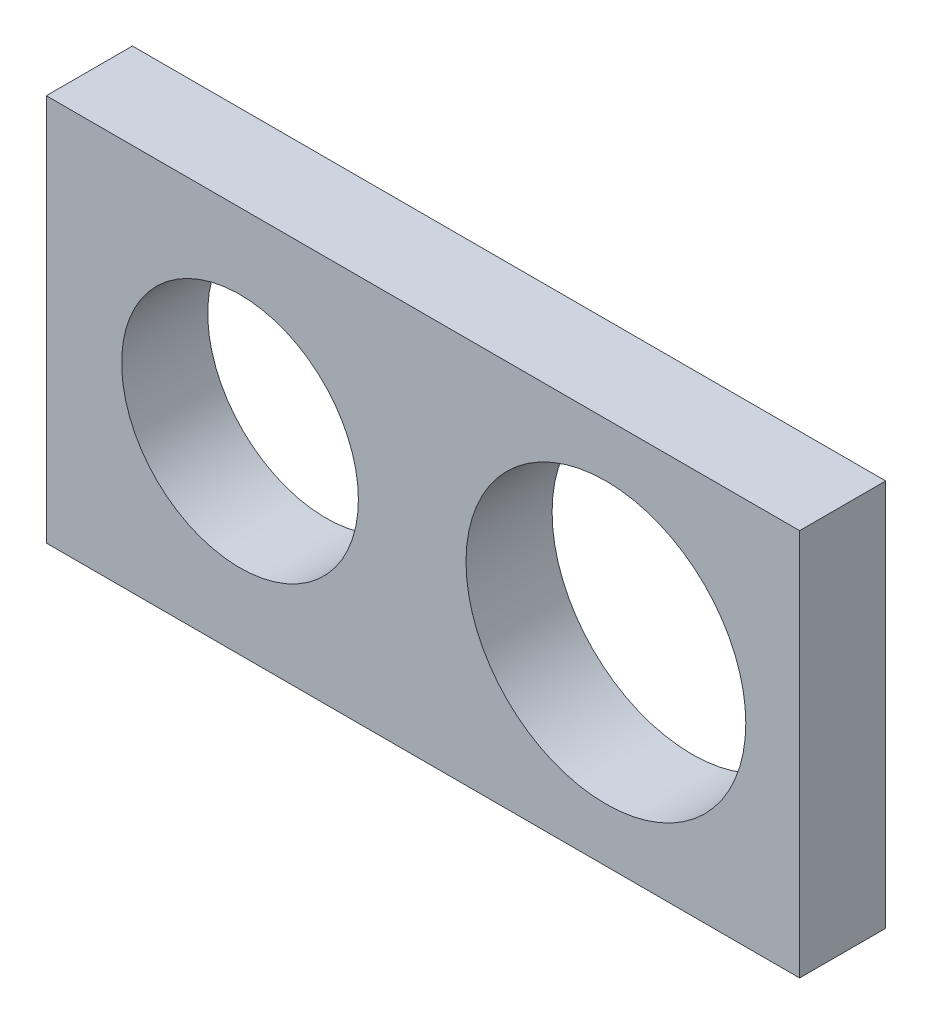
ISO-10303-21;
HEADER;
FILE_DESCRIPTION(('STEP AP214'),'2;1');
FILE_NAME('part.step','',(''),(''),'','','');
FILE_SCHEMA(('AUTOMOTIVE_DESIGN { 1 0 10303 214 1 1 1 1 }'));
ENDSEC;
DATA;
#1=APPLICATION_CONTEXT('core data for automotive mechanical design processes');
#2=APPLICATION_PROTOCOL_DEFINITION('international standard','automotive_design',2000,#1);
#3=PRODUCT_CONTEXT('',#1,'mechanical');
#4=PRODUCT('Part','Part','',(#3));
#5=PRODUCT_RELATED_PRODUCT_CATEGORY('part','',(#4));
#6=PRODUCT_DEFINITION_FORMATION('','',#4);
#7=PRODUCT_DEFINITION_CONTEXT('part definition',#1,'design');
#8=PRODUCT_DEFINITION('design','',#6,#7);
#9=PRODUCT_DEFINITION_SHAPE('','',#8);
#10=(LENGTH_UNIT() NAMED_UNIT(*) SI_UNIT(.MILLI.,.METRE.));
#11=(NAMED_UNIT(*) PLANE_ANGLE_UNIT() SI_UNIT($,.RADIAN.));
#12=(NAMED_UNIT(*) SI_UNIT($,.STERADIAN.) SOLID_ANGLE_UNIT());
#13=UNCERTAINTY_MEASURE_WITH_UNIT(LENGTH_MEASURE(1.E-05),#10,'distance_accuracy_value','');
#14=(GEOMETRIC_REPRESENTATION_CONTEXT(3) GLOBAL_UNCERTAINTY_ASSIGNED_CONTEXT((#13)) GLOBAL_UNIT_ASSIGNED_CONTEXT((#10,
#11,#12)) REPRESENTATION_CONTEXT('',''));
#15=CARTESIAN_POINT('',(0.,0.,0.));
#16=DIRECTION('',(0.,0.,1.));
#17=DIRECTION('',(1.,0.,0.));
#18=AXIS2_PLACEMENT_3D('',#15,#16,#17);
#19=CARTESIAN_POINT('',(-35.,18.,8.));
#20=DIRECTION('',(1.,0.,0.));
#21=DIRECTION('',(0.,0.,-1.));
#22=AXIS2_PLACEMENT_3D('',#19,#20,#21);
#23=PLANE('',#22);
#24=DIRECTION('',(0.,-1.,0.));
#25=VECTOR('',#24,1.);
#26=CARTESIAN_POINT('',(-35.,18.,0.));
#27=LINE('',#26,#25);
#28=CARTESIAN_POINT('',(-35.,18.,0.));
#29=VERTEX_POINT('',#28);
#30=CARTESIAN_POINT('',(-35.,-18.,0.));
#31=VERTEX_POINT('',#30);
#32=EDGE_CURVE('E103',#29,#31,#27,.T.);
#33=ORIENTED_EDGE('',*,*,#32,.T.);
#34=DIRECTION('',(0.,0.,-1.));
#35=VECTOR('',#34,1.);
#36=CARTESIAN_POINT('',(-35.,-18.,8.));
#37=LINE('',#36,#35);
#38=CARTESIAN_POINT('',(-35.,-18.,8.));
#39=VERTEX_POINT('',#38);
#40=EDGE_CURVE('E11',#39,#31,#37,.T.);
#41=ORIENTED_EDGE('',*,*,#40,.F.);
#42=DIRECTION('',(0.,-1.,0.));
#43=VECTOR('',#42,1.);
#44=CARTESIAN_POINT('',(-35.,18.,8.));
#45=LINE('',#44,#43);
#46=CARTESIAN_POINT('',(-35.,18.,8.));
#47=VERTEX_POINT('',#46);
#48=EDGE_CURVE('E90',#47,#39,#45,.T.);
#49=ORIENTED_EDGE('',*,*,#48,.F.);
#50=DIRECTION('',(0.,0.,-1.));
#51=VECTOR('',#50,1.);
#52=CARTESIAN_POINT('',(-35.,18.,8.));
#53=LINE('',#52,#51);
#54=EDGE_CURVE('E99',#47,#29,#53,.T.);
#55=ORIENTED_EDGE('',*,*,#54,.T.);
#56=EDGE_LOOP('',(#33,#41,#49,#55));
#57=FACE_BOUND('',#56,.T.);
#58=ADVANCED_FACE('F37',(#57),#23,.F.);
#59=CARTESIAN_POINT('',(-35.,-18.,8.));
#60=DIRECTION('',(0.,1.,0.));
#61=DIRECTION('',(0.,0.,1.));
#62=AXIS2_PLACEMENT_3D('',#59,#60,#61);
#63=PLANE('',#62);
#64=DIRECTION('',(1.,0.,0.));
#65=VECTOR('',#64,1.);
#66=CARTESIAN_POINT('',(-35.,-18.,0.));
#67=LINE('',#66,#65);
#68=CARTESIAN_POINT('',(35.,-18.,0.));
#69=VERTEX_POINT('',#68);
#70=EDGE_CURVE('E94',#31,#69,#67,.T.);
#71=ORIENTED_EDGE('',*,*,#70,.T.);
#72=DIRECTION('',(0.,0.,-1.));
#73=VECTOR('',#72,1.);
#74=CARTESIAN_POINT('',(35.,-18.,8.));
#75=LINE('',#74,#73);
#76=CARTESIAN_POINT('',(35.,-18.,8.));
#77=VERTEX_POINT('',#76);
#78=EDGE_CURVE('E46',#77,#69,#75,.T.);
#79=ORIENTED_EDGE('',*,*,#78,.F.);
#80=DIRECTION('',(1.,0.,0.));
#81=VECTOR('',#80,1.);
#82=CARTESIAN_POINT('',(-35.,-18.,8.));
#83=LINE('',#82,#81);
#84=EDGE_CURVE('E85',#39,#77,#83,.T.);
#85=ORIENTED_EDGE('',*,*,#84,.F.);
#86=ORIENTED_EDGE('',*,*,#40,.T.);
#87=EDGE_LOOP('',(#71,#79,#85,#86));
#88=FACE_BOUND('',#87,.T.);
#89=ADVANCED_FACE('F93',(#88),#63,.F.);
#90=CARTESIAN_POINT('',(35.,-18.,8.));
#91=DIRECTION('',(-1.,0.,0.));
#92=DIRECTION('',(0.,0.,1.));
#93=AXIS2_PLACEMENT_3D('',#90,#91,#92);
#94=PLANE('',#93);
#95=DIRECTION('',(0.,1.,0.));
#96=VECTOR('',#95,1.);
#97=CARTESIAN_POINT('',(35.,-18.,0.));
#98=LINE('',#97,#96);
#99=CARTESIAN_POINT('',(35.,18.,0.));
#100=VERTEX_POINT('',#99);
#101=EDGE_CURVE('E72',#69,#100,#98,.T.);
#102=ORIENTED_EDGE('',*,*,#101,.T.);
#103=DIRECTION('',(0.,0.,-1.));
#104=VECTOR('',#103,1.);
#105=CARTESIAN_POINT('',(35.,18.,8.));
#106=LINE('',#105,#104);
#107=CARTESIAN_POINT('',(35.,18.,8.));
#108=VERTEX_POINT('',#107);
#109=EDGE_CURVE('E95',#108,#100,#106,.T.);
#110=ORIENTED_EDGE('',*,*,#109,.F.);
#111=DIRECTION('',(0.,1.,0.));
#112=VECTOR('',#111,1.);
#113=CARTESIAN_POINT('',(35.,-18.,8.));
#114=LINE('',#113,#112);
#115=EDGE_CURVE('E88',#77,#108,#114,.T.);
#116=ORIENTED_EDGE('',*,*,#115,.F.);
#117=ORIENTED_EDGE('',*,*,#78,.T.);
#118=EDGE_LOOP('',(#102,#110,#116,#117));
#119=FACE_BOUND('',#118,.T.);
#120=ADVANCED_FACE('F97',(#119),#94,.F.);
#121=CARTESIAN_POINT('',(35.,18.,8.));
#122=DIRECTION('',(0.,-1.,0.));
#123=DIRECTION('',(0.,0.,-1.));
#124=AXIS2_PLACEMENT_3D('',#121,#122,#123);
#125=PLANE('',#124);
#126=DIRECTION('',(-1.,0.,0.));
#127=VECTOR('',#126,1.);
#128=CARTESIAN_POINT('',(35.,18.,0.));
#129=LINE('',#128,#127);
#130=EDGE_CURVE('E78',#100,#29,#129,.T.);
#131=ORIENTED_EDGE('',*,*,#130,.T.);
#132=ORIENTED_EDGE('',*,*,#54,.F.);
#133=DIRECTION('',(-1.,0.,0.));
#134=VECTOR('',#133,1.);
#135=CARTESIAN_POINT('',(35.,18.,8.));
#136=LINE('',#135,#134);
#137=EDGE_CURVE('E55',#108,#47,#136,.T.);
#138=ORIENTED_EDGE('',*,*,#137,.F.);
#139=ORIENTED_EDGE('',*,*,#109,.T.);
#140=EDGE_LOOP('',(#131,#132,#138,#139));
#141=FACE_BOUND('',#140,.T.);
#142=ADVANCED_FACE('F131',(#141),#125,.F.);
#143=CARTESIAN_POINT('',(0.,0.,8.));
#144=DIRECTION('',(0.,0.,1.));
#145=DIRECTION('',(1.,0.,0.));
#146=AXIS2_PLACEMENT_3D('',#143,#144,#145);
#147=PLANE('',#146);
#148=CARTESIAN_POINT('',(-17.,0.,8.));
#149=DIRECTION('',(0.,0.,1.));
#150=DIRECTION('',(1.,0.,0.));
#151=AXIS2_PLACEMENT_3D('',#148,#149,#150);
#152=CIRCLE('',#151,11.);
#153=CARTESIAN_POINT('',(-6.,0.,8.));
#154=VERTEX_POINT('',#153);
#155=EDGE_CURVE('E106',#154,#154,#152,.T.);
#156=ORIENTED_EDGE('',*,*,#155,.F.);
#157=EDGE_LOOP('',(#156));
#158=FACE_BOUND('',#157,.T.);
#159=CARTESIAN_POINT('',(17.,0.,8.));
#160=DIRECTION('',(0.,0.,1.));
#161=DIRECTION('',(1.,0.,0.));
#162=AXIS2_PLACEMENT_3D('',#159,#160,#161);
#163=CIRCLE('',#162,13.);
#164=CARTESIAN_POINT('',(30.,0.,8.));
#165=VERTEX_POINT('',#164);
#166=EDGE_CURVE('E113',#165,#165,#163,.T.);
#167=ORIENTED_EDGE('',*,*,#166,.F.);
#168=EDGE_LOOP('',(#167));
#169=FACE_BOUND('',#168,.T.);
#170=ORIENTED_EDGE('',*,*,#48,.T.);
#171=ORIENTED_EDGE('',*,*,#84,.T.);
#172=ORIENTED_EDGE('',*,*,#115,.T.);
#173=ORIENTED_EDGE('',*,*,#137,.T.);
#174=EDGE_LOOP('',(#170,#171,#172,#173));
#175=FACE_BOUND('',#174,.T.);
#176=ADVANCED_FACE('F86',(#158,#169,#175),#147,.T.);
#177=CARTESIAN_POINT('',(0.,0.,0.));
#178=DIRECTION('',(0.,0.,1.));
#179=DIRECTION('',(1.,0.,0.));
#180=AXIS2_PLACEMENT_3D('',#177,#178,#179);
#181=PLANE('',#180);
#182=CARTESIAN_POINT('',(-17.,0.,0.));
#183=DIRECTION('',(0.,0.,1.));
#184=DIRECTION('',(1.,0.,0.));
#185=AXIS2_PLACEMENT_3D('',#182,#183,#184);
#186=CIRCLE('',#185,11.);
#187=CARTESIAN_POINT('',(-6.,0.,0.));
#188=VERTEX_POINT('',#187);
#189=EDGE_CURVE('E40',#188,#188,#186,.T.);
#190=ORIENTED_EDGE('',*,*,#189,.T.);
#191=EDGE_LOOP('',(#190));
#192=FACE_BOUND('',#191,.T.);
#193=CARTESIAN_POINT('',(17.,0.,0.));
#194=DIRECTION('',(0.,0.,1.));
#195=DIRECTION('',(1.,0.,0.));
#196=AXIS2_PLACEMENT_3D('',#193,#194,#195);
#197=CIRCLE('',#196,13.);
#198=CARTESIAN_POINT('',(30.,0.,0.));
#199=VERTEX_POINT('',#198);
#200=EDGE_CURVE('E111',#199,#199,#197,.T.);
#201=ORIENTED_EDGE('',*,*,#200,.T.);
#202=EDGE_LOOP('',(#201));
#203=FACE_BOUND('',#202,.T.);
#204=ORIENTED_EDGE('',*,*,#32,.F.);
#205=ORIENTED_EDGE('',*,*,#130,.F.);
#206=ORIENTED_EDGE('',*,*,#101,.F.);
#207=ORIENTED_EDGE('',*,*,#70,.F.);
#208=EDGE_LOOP('',(#204,#205,#206,#207));
#209=FACE_BOUND('',#208,.T.);
#210=ADVANCED_FACE('F130',(#192,#203,#209),#181,.F.);
#211=CARTESIAN_POINT('',(17.,0.,-15.));
#212=DIRECTION('',(0.,0.,1.));
#213=DIRECTION('',(1.,0.,0.));
#214=AXIS2_PLACEMENT_3D('',#211,#212,#213);
#215=CYLINDRICAL_SURFACE('',#214,13.);
#216=ORIENTED_EDGE('',*,*,#166,.T.);
#217=EDGE_LOOP('',(#216));
#218=FACE_BOUND('',#217,.T.);
#219=ORIENTED_EDGE('',*,*,#200,.F.);
#220=EDGE_LOOP('',(#219));
#221=FACE_BOUND('',#220,.T.);
#222=ADVANCED_FACE('F137',(#218,#221),#215,.F.);
#223=CARTESIAN_POINT('',(-17.,0.,-15.));
#224=DIRECTION('',(0.,0.,1.));
#225=DIRECTION('',(1.,0.,0.));
#226=AXIS2_PLACEMENT_3D('',#223,#224,#225);
#227=CYLINDRICAL_SURFACE('',#226,11.);
#228=ORIENTED_EDGE('',*,*,#155,.T.);
#229=EDGE_LOOP('',(#228));
#230=FACE_BOUND('',#229,.T.);
#231=ORIENTED_EDGE('',*,*,#189,.F.);
#232=EDGE_LOOP('',(#231));
#233=FACE_BOUND('',#232,.T.);
#234=ADVANCED_FACE('F125',(#230,#233),#227,.F.);
#235=CLOSED_SHELL('',(#58,#89,#120,#142,#176,#210,#222,#234));
#236=MANIFOLD_SOLID_BREP('B2',#235);
#237=ADVANCED_BREP_SHAPE_REPRESENTATION('',(#18,#236),#14);
#238=SHAPE_DEFINITION_REPRESENTATION(#9,#237);
ENDSEC;
END-ISO-10303-21;
